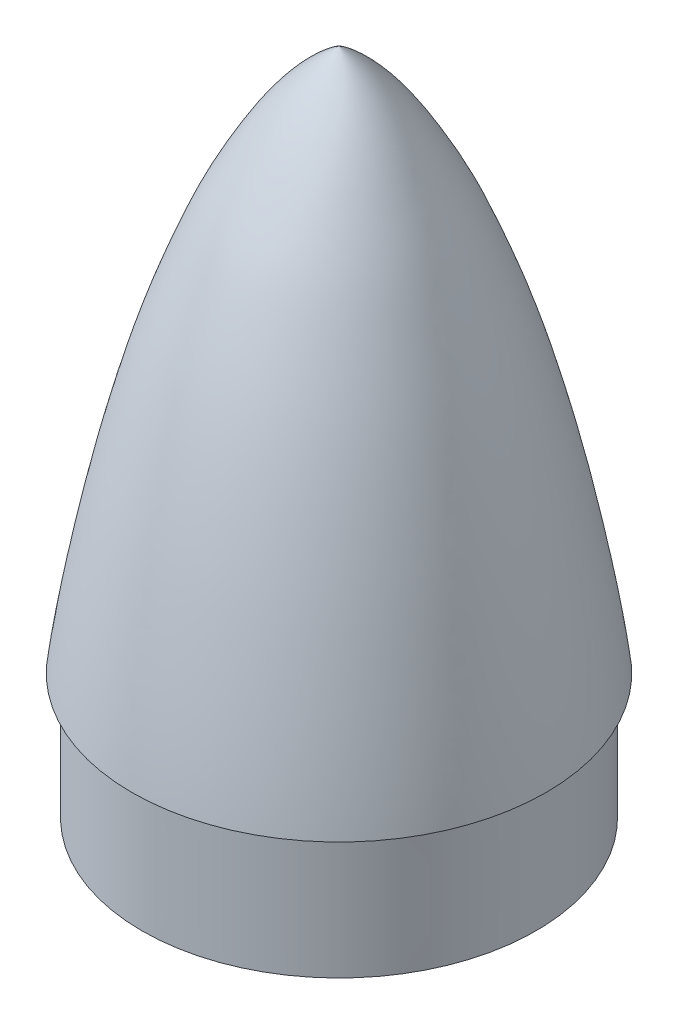
ISO-10303-21;
HEADER;
FILE_DESCRIPTION(('STEP AP214'),'2;1');
FILE_NAME('part.step','',(''),(''),'','','');
FILE_SCHEMA(('AUTOMOTIVE_DESIGN { 1 0 10303 214 1 1 1 1 }'));
ENDSEC;
DATA;
#1=APPLICATION_CONTEXT('core data for automotive mechanical design processes');
#2=APPLICATION_PROTOCOL_DEFINITION('international standard','automotive_design',2000,#1);
#3=PRODUCT_CONTEXT('',#1,'mechanical');
#4=PRODUCT('Part','Part','',(#3));
#5=PRODUCT_RELATED_PRODUCT_CATEGORY('part','',(#4));
#6=PRODUCT_DEFINITION_FORMATION('','',#4);
#7=PRODUCT_DEFINITION_CONTEXT('part definition',#1,'design');
#8=PRODUCT_DEFINITION('design','',#6,#7);
#9=PRODUCT_DEFINITION_SHAPE('','',#8);
#10=(LENGTH_UNIT() NAMED_UNIT(*) SI_UNIT(.MILLI.,.METRE.));
#11=(NAMED_UNIT(*) PLANE_ANGLE_UNIT() SI_UNIT($,.RADIAN.));
#12=(NAMED_UNIT(*) SI_UNIT($,.STERADIAN.) SOLID_ANGLE_UNIT());
#13=UNCERTAINTY_MEASURE_WITH_UNIT(LENGTH_MEASURE(1.E-05),#10,'distance_accuracy_value','');
#14=(GEOMETRIC_REPRESENTATION_CONTEXT(3) GLOBAL_UNCERTAINTY_ASSIGNED_CONTEXT((#13)) GLOBAL_UNIT_ASSIGNED_CONTEXT((#10,
#11,#12)) REPRESENTATION_CONTEXT('',''));
#15=CARTESIAN_POINT('',(0.,0.,0.));
#16=DIRECTION('',(0.,0.,1.));
#17=DIRECTION('',(1.,0.,0.));
#18=AXIS2_PLACEMENT_3D('',#15,#16,#17);
#19=CARTESIAN_POINT('',(0.,665.75091535108,0.));
#20=DIRECTION('',(0.,-1.,0.));
#21=DIRECTION('',(0.,0.,-1.));
#22=AXIS2_PLACEMENT_3D('',#19,#20,#21);
#23=PLANE('',#22);
#24=CARTESIAN_POINT('',(0.,665.750915351079,41.2749977111816));
#25=DIRECTION('',(0.,-1.,0.));
#26=DIRECTION('',(0.,0.,-1.));
#27=AXIS2_PLACEMENT_3D('',#24,#25,#26);
#28=CIRCLE('',#27,37.9834258979612);
#29=CARTESIAN_POINT('',(0.,665.750915351079,3.29157181322044));
#30=VERTEX_POINT('',#29);
#31=EDGE_CURVE('E11',#30,#30,#28,.T.);
#32=ORIENTED_EDGE('',*,*,#31,.F.);
#33=EDGE_LOOP('',(#32));
#34=FACE_BOUND('',#33,.T.);
#35=CARTESIAN_POINT('',(0.,665.75091535108,41.2749977111816));
#36=DIRECTION('',(0.,-1.,0.));
#37=DIRECTION('',(0.,0.,-1.));
#38=AXIS2_PLACEMENT_3D('',#35,#36,#37);
#39=CIRCLE('',#38,29.2100012441642);
#40=CARTESIAN_POINT('',(0.,665.75091535108,12.0649964670175));
#41=VERTEX_POINT('',#40);
#42=EDGE_CURVE('E66',#41,#41,#39,.T.);
#43=ORIENTED_EDGE('',*,*,#42,.T.);
#44=EDGE_LOOP('',(#43));
#45=FACE_BOUND('',#44,.T.);
#46=ADVANCED_FACE('F43',(#34,#45),#23,.F.);
#47=CARTESIAN_POINT('',(0.,663.741413509053,79.6449911153105));
#48=CARTESIAN_POINT('',(0.,672.085184465598,77.9917468590793));
#49=CARTESIAN_POINT('',(0.,683.567637920691,76.5774836022197));
#50=CARTESIAN_POINT('',(0.,697.481376301469,73.5157250575483));
#51=CARTESIAN_POINT('',(0.,706.550597685503,71.3141446331683));
#52=CARTESIAN_POINT('',(0.,715.069986837517,69.0014119969695));
#53=CARTESIAN_POINT('',(0.,724.325296016045,66.0887625994698));
#54=CARTESIAN_POINT('',(0.,732.706904647798,62.9567299176322));
#55=CARTESIAN_POINT('',(0.,740.966851543454,59.5836304892239));
#56=CARTESIAN_POINT('',(0.,752.610789374506,53.4803713057005));
#57=CARTESIAN_POINT('',(0.,761.306326879529,47.7225396828501));
#58=CARTESIAN_POINT('',(0.,766.,41.2749977111816));
#59=B_SPLINE_CURVE_WITH_KNOTS('',3,(#47,#48,#49,#50,#51,#52,#53,#54,#55,#56,#57,#58),
.UNSPECIFIED.,.F.,.F.,(4,1,1,1,1,1,1,1,1,4),(0.,0.229345083598097,0.311367757976783,
0.383988250708974,0.480976640779294,0.549325678852165,0.645508394689675,0.722205603043886,
0.78960648442318,1.),.UNSPECIFIED.);
#60=CARTESIAN_POINT('',(0.,663.718915351267,41.2749977111816));
#61=DIRECTION('',(0.,-1.,0.));
#62=AXIS1_PLACEMENT('',#60,#61);
#63=SURFACE_OF_REVOLUTION('',#59,#62);
#64=CARTESIAN_POINT('',(0.,766.,41.2749977111816));
#65=VERTEX_POINT('',#64);
#66=VERTEX_LOOP('',#65);
#67=FACE_BOUND('',#66,.T.);
#68=ORIENTED_EDGE('',*,*,#31,.T.);
#69=EDGE_LOOP('',(#68));
#70=FACE_BOUND('',#69,.T.);
#71=ADVANCED_FACE('F56',(#67,#70),#63,.T.);
#72=CARTESIAN_POINT('',(0.,663.741999856662,80.6449909434088));
#73=CARTESIAN_POINT('',(0.,672.274081846555,79.5495150284655));
#74=CARTESIAN_POINT('',(0.,683.715125997956,77.4705304733822));
#75=CARTESIAN_POINT('',(0.,697.722929966956,74.4990738423976));
#76=CARTESIAN_POINT('',(0.,709.269064542185,71.6733767569118));
#77=CARTESIAN_POINT('',(0.,721.269154813901,68.2980602344515));
#78=CARTESIAN_POINT('',(0.,733.092990878118,63.8801373873335));
#79=CARTESIAN_POINT('',(0.,741.405259678136,60.4832893672494));
#80=CARTESIAN_POINT('',(0.,753.370793332599,54.2087213862572));
#81=CARTESIAN_POINT('',(0.,762.365061791427,48.2424314959168));
#82=CARTESIAN_POINT('',(0.,767.,41.2749977111816));
#83=B_SPLINE_CURVE_WITH_KNOTS('',3,(#72,#73,#74,#75,#76,#77,#78,#79,#80,#81,#82),.UNSPECIFIED.,
.F.,.F.,(4,1,1,1,1,1,1,1,4),(0.,0.228759558804534,0.309272631683737,0.380932336521857,
0.545032449649137,0.640457782126925,0.716706437735697,0.783654624598538,1.),.UNSPECIFIED.);
#84=CARTESIAN_POINT('',(0.,663.718915351267,41.2749977111816));
#85=DIRECTION('',(0.,-1.,0.));
#86=AXIS1_PLACEMENT('',#84,#85);
#87=SURFACE_OF_REVOLUTION('',#83,#86);
#88=CARTESIAN_POINT('',(0.,767.,41.2749977111816));
#89=VERTEX_POINT('',#88);
#90=VERTEX_LOOP('',#89);
#91=FACE_BOUND('',#90,.T.);
#92=CARTESIAN_POINT('',(0.,663.741999856662,41.2749977111816));
#93=DIRECTION('',(0.,-1.,0.));
#94=DIRECTION('',(0.,0.,-1.));
#95=AXIS2_PLACEMENT_3D('',#92,#93,#94);
#96=CIRCLE('',#95,39.3699932322271);
#97=CARTESIAN_POINT('',(0.,663.741999856662,1.90500447895452));
#98=VERTEX_POINT('',#97);
#99=EDGE_CURVE('E50',#98,#98,#96,.T.);
#100=ORIENTED_EDGE('',*,*,#99,.F.);
#101=EDGE_LOOP('',(#100));
#102=FACE_BOUND('',#101,.T.);
#103=ADVANCED_FACE('F59',(#91,#102),#87,.F.);
#104=CARTESIAN_POINT('',(0.,663.740880036198,41.2749977111816));
#105=DIRECTION('',(0.,1.,0.));
#106=DIRECTION('',(0.,0.,1.));
#107=AXIS2_PLACEMENT_3D('',#104,#105,#106);
#108=CONICAL_SURFACE('',#107,37.4601700262271,1.57020997915162);
#109=ORIENTED_EDGE('',*,*,#99,.T.);
#110=EDGE_LOOP('',(#109));
#111=FACE_BOUND('',#110,.T.);
#112=CARTESIAN_POINT('',(0.,663.740880036198,41.2749977111816));
#113=DIRECTION('',(0.,-1.,0.));
#114=DIRECTION('',(0.,0.,-1.));
#115=AXIS2_PLACEMENT_3D('',#112,#113,#114);
#116=CIRCLE('',#115,37.4601700262271);
#117=CARTESIAN_POINT('',(0.,663.740880036198,3.8148276849545));
#118=VERTEX_POINT('',#117);
#119=EDGE_CURVE('E87',#118,#118,#116,.T.);
#120=ORIENTED_EDGE('',*,*,#119,.F.);
#121=EDGE_LOOP('',(#120));
#122=FACE_BOUND('',#121,.T.);
#123=ADVANCED_FACE('F92',(#111,#122),#108,.T.);
#124=CARTESIAN_POINT('',(0.,663.740880036198,41.2749977111816));
#125=DIRECTION('',(0.,-1.,0.));
#126=DIRECTION('',(0.,0.,-1.));
#127=AXIS2_PLACEMENT_3D('',#124,#125,#126);
#128=CONICAL_SURFACE('',#127,37.4601700262271,0.000203451863905546);
#129=CARTESIAN_POINT('',(0.,640.,41.2749977111816));
#130=DIRECTION('',(0.,-1.,0.));
#131=DIRECTION('',(0.,0.,-1.));
#132=AXIS2_PLACEMENT_3D('',#129,#130,#131);
#133=CIRCLE('',#132,37.4650001525879);
#134=CARTESIAN_POINT('',(0.,640.,3.80999755859374));
#135=VERTEX_POINT('',#134);
#136=EDGE_CURVE('E84',#135,#135,#133,.T.);
#137=ORIENTED_EDGE('',*,*,#136,.F.);
#138=EDGE_LOOP('',(#137));
#139=FACE_BOUND('',#138,.T.);
#140=ORIENTED_EDGE('',*,*,#119,.T.);
#141=EDGE_LOOP('',(#140));
#142=FACE_BOUND('',#141,.T.);
#143=ADVANCED_FACE('F100',(#139,#142),#128,.T.);
#144=CARTESIAN_POINT('',(0.,640.,0.));
#145=DIRECTION('',(0.,1.,0.));
#146=DIRECTION('',(0.,0.,1.));
#147=AXIS2_PLACEMENT_3D('',#144,#145,#146);
#148=PLANE('',#147);
#149=CARTESIAN_POINT('',(0.,640.,41.2749977111816));
#150=DIRECTION('',(0.,-1.,0.));
#151=DIRECTION('',(0.,0.,-1.));
#152=AXIS2_PLACEMENT_3D('',#149,#150,#151);
#153=CIRCLE('',#152,35.5600001525879);
#154=CARTESIAN_POINT('',(0.,640.,5.71499755859375));
#155=VERTEX_POINT('',#154);
#156=EDGE_CURVE('E81',#155,#155,#153,.T.);
#157=ORIENTED_EDGE('',*,*,#156,.F.);
#158=EDGE_LOOP('',(#157));
#159=FACE_BOUND('',#158,.T.);
#160=ORIENTED_EDGE('',*,*,#136,.T.);
#161=EDGE_LOOP('',(#160));
#162=FACE_BOUND('',#161,.T.);
#163=ADVANCED_FACE('F111',(#159,#162),#148,.F.);
#164=CARTESIAN_POINT('',(0.,663.718915351267,41.2749977111816));
#165=DIRECTION('',(0.,-1.,0.));
#166=DIRECTION('',(0.,0.,-1.));
#167=AXIS2_PLACEMENT_3D('',#164,#165,#166);
#168=CYLINDRICAL_SURFACE('',#167,35.5600001525879);
#169=CARTESIAN_POINT('',(0.,663.739765875943,41.2749977111816));
#170=DIRECTION('',(0.,-1.,0.));
#171=DIRECTION('',(0.,0.,-1.));
#172=AXIS2_PLACEMENT_3D('',#169,#170,#171);
#173=CIRCLE('',#172,35.5600001525879);
#174=CARTESIAN_POINT('',(0.,663.739765875943,5.71499755859374));
#175=VERTEX_POINT('',#174);
#176=EDGE_CURVE('E71',#175,#175,#173,.T.);
#177=ORIENTED_EDGE('',*,*,#176,.F.);
#178=EDGE_LOOP('',(#177));
#179=FACE_BOUND('',#178,.T.);
#180=ORIENTED_EDGE('',*,*,#156,.T.);
#181=EDGE_LOOP('',(#180));
#182=FACE_BOUND('',#181,.T.);
#183=ADVANCED_FACE('F115',(#179,#182),#168,.F.);
#184=CARTESIAN_POINT('',(0.,663.739765875943,41.2749977111816));
#185=DIRECTION('',(0.,1.,0.));
#186=DIRECTION('',(0.,0.,1.));
#187=AXIS2_PLACEMENT_3D('',#184,#185,#186);
#188=CONICAL_SURFACE('',#187,35.5600001525879,1.57020997915152);
#189=CARTESIAN_POINT('',(0.,663.736042568621,41.2749977111816));
#190=DIRECTION('',(0.,-1.,0.));
#191=DIRECTION('',(0.,0.,-1.));
#192=AXIS2_PLACEMENT_3D('',#189,#190,#191);
#193=CIRCLE('',#192,29.2100012441642);
#194=CARTESIAN_POINT('',(0.,663.736042568621,12.0649964670175));
#195=VERTEX_POINT('',#194);
#196=EDGE_CURVE('E68',#195,#195,#193,.T.);
#197=ORIENTED_EDGE('',*,*,#196,.F.);
#198=EDGE_LOOP('',(#197));
#199=FACE_BOUND('',#198,.T.);
#200=ORIENTED_EDGE('',*,*,#176,.T.);
#201=EDGE_LOOP('',(#200));
#202=FACE_BOUND('',#201,.T.);
#203=ADVANCED_FACE('F119',(#199,#202),#188,.T.);
#204=CARTESIAN_POINT('',(0.,663.718915351267,41.2749977111816));
#205=DIRECTION('',(0.,-1.,0.));
#206=DIRECTION('',(0.,0.,-1.));
#207=AXIS2_PLACEMENT_3D('',#204,#205,#206);
#208=CYLINDRICAL_SURFACE('',#207,29.2100012441642);
#209=ORIENTED_EDGE('',*,*,#42,.F.);
#210=EDGE_LOOP('',(#209));
#211=FACE_BOUND('',#210,.T.);
#212=ORIENTED_EDGE('',*,*,#196,.T.);
#213=EDGE_LOOP('',(#212));
#214=FACE_BOUND('',#213,.T.);
#215=ADVANCED_FACE('F123',(#211,#214),#208,.F.);
#216=CLOSED_SHELL('',(#46,#71,#103,#123,#143,#163,#183,#203,#215));
#217=MANIFOLD_SOLID_BREP('B2',#216);
#218=ADVANCED_BREP_SHAPE_REPRESENTATION('',(#18,#217),#14);
#219=SHAPE_DEFINITION_REPRESENTATION(#9,#218);
ENDSEC;
END-ISO-10303-21;
